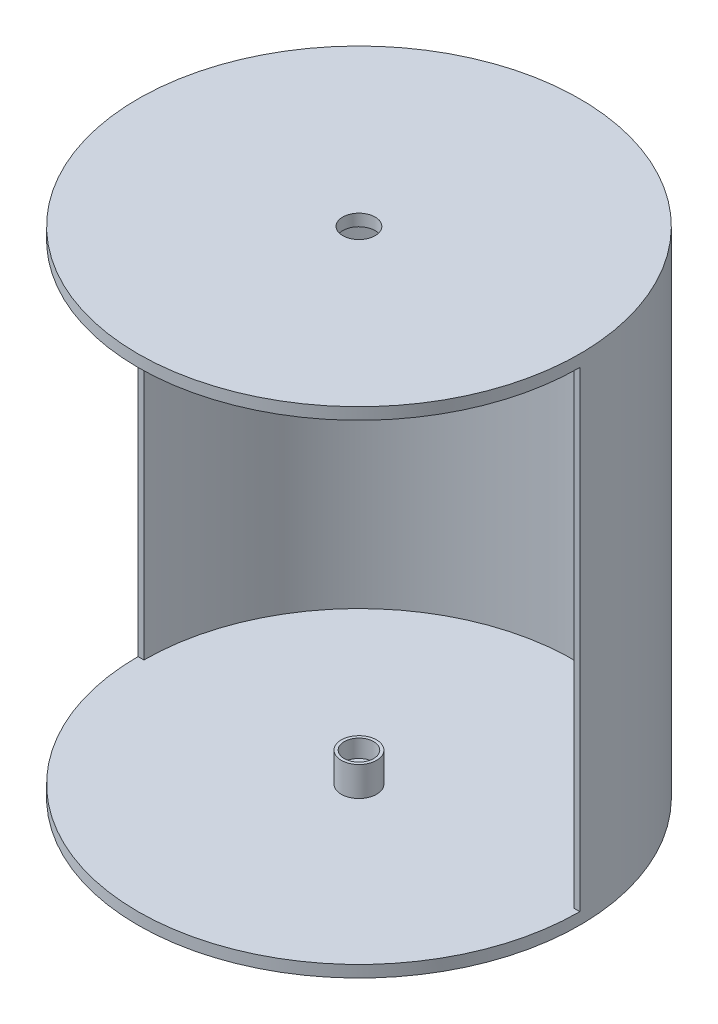
ISO-10303-21;
HEADER;
FILE_DESCRIPTION(('STEP AP214'),'2;1');
FILE_NAME('part.step','',(''),(''),'','','');
FILE_SCHEMA(('AUTOMOTIVE_DESIGN { 1 0 10303 214 1 1 1 1 }'));
ENDSEC;
DATA;
#1=APPLICATION_CONTEXT('core data for automotive mechanical design processes');
#2=APPLICATION_PROTOCOL_DEFINITION('international standard','automotive_design',2000,#1);
#3=PRODUCT_CONTEXT('',#1,'mechanical');
#4=PRODUCT('Part','Part','',(#3));
#5=PRODUCT_RELATED_PRODUCT_CATEGORY('part','',(#4));
#6=PRODUCT_DEFINITION_FORMATION('','',#4);
#7=PRODUCT_DEFINITION_CONTEXT('part definition',#1,'design');
#8=PRODUCT_DEFINITION('design','',#6,#7);
#9=PRODUCT_DEFINITION_SHAPE('','',#8);
#10=(LENGTH_UNIT() NAMED_UNIT(*) SI_UNIT(.MILLI.,.METRE.));
#11=(NAMED_UNIT(*) PLANE_ANGLE_UNIT() SI_UNIT($,.RADIAN.));
#12=(NAMED_UNIT(*) SI_UNIT($,.STERADIAN.) SOLID_ANGLE_UNIT());
#13=UNCERTAINTY_MEASURE_WITH_UNIT(LENGTH_MEASURE(1.E-05),#10,'distance_accuracy_value','');
#14=(GEOMETRIC_REPRESENTATION_CONTEXT(3) GLOBAL_UNCERTAINTY_ASSIGNED_CONTEXT((#13)) GLOBAL_UNIT_ASSIGNED_CONTEXT((#10,
#11,#12)) REPRESENTATION_CONTEXT('',''));
#15=CARTESIAN_POINT('',(0.,0.,0.));
#16=DIRECTION('',(0.,0.,1.));
#17=DIRECTION('',(1.,0.,0.));
#18=AXIS2_PLACEMENT_3D('',#15,#16,#17);
#19=CARTESIAN_POINT('',(0.,2.,0.));
#20=DIRECTION('',(0.,1.,0.));
#21=DIRECTION('',(0.,0.,1.));
#22=AXIS2_PLACEMENT_3D('',#19,#20,#21);
#23=PLANE('',#22);
#24=CARTESIAN_POINT('',(0.,2.,0.));
#25=DIRECTION('',(0.,1.,0.));
#26=DIRECTION('',(0.,0.,1.));
#27=AXIS2_PLACEMENT_3D('',#24,#25,#26);
#28=CIRCLE('',#27,3.);
#29=CARTESIAN_POINT('',(0.,2.,3.));
#30=VERTEX_POINT('',#29);
#31=EDGE_CURVE('E140',#30,#30,#28,.T.);
#32=ORIENTED_EDGE('',*,*,#31,.F.);
#33=EDGE_LOOP('',(#32));
#34=FACE_BOUND('',#33,.T.);
#35=CARTESIAN_POINT('',(0.,2.,0.));
#36=DIRECTION('',(0.,-1.,0.));
#37=DIRECTION('',(0.,0.,1.));
#38=AXIS2_PLACEMENT_3D('',#35,#36,#37);
#39=CIRCLE('',#38,36.5);
#40=CARTESIAN_POINT('',(-36.5,2.,0.));
#41=VERTEX_POINT('',#40);
#42=CARTESIAN_POINT('',(36.5,2.,0.));
#43=VERTEX_POINT('',#42);
#44=EDGE_CURVE('E122',#41,#43,#39,.T.);
#45=ORIENTED_EDGE('',*,*,#44,.F.);
#46=DIRECTION('',(1.,0.,0.));
#47=VECTOR('',#46,1.);
#48=CARTESIAN_POINT('',(-37.5,2.,0.));
#49=LINE('',#48,#47);
#50=CARTESIAN_POINT('',(-37.5,2.,0.));
#51=VERTEX_POINT('',#50);
#52=EDGE_CURVE('E109',#51,#41,#49,.T.);
#53=ORIENTED_EDGE('',*,*,#52,.F.);
#54=CARTESIAN_POINT('',(0.,2.,0.));
#55=DIRECTION('',(0.,1.,0.));
#56=DIRECTION('',(0.,0.,1.));
#57=AXIS2_PLACEMENT_3D('',#54,#55,#56);
#58=CIRCLE('',#57,37.5);
#59=CARTESIAN_POINT('',(37.5,2.,0.));
#60=VERTEX_POINT('',#59);
#61=EDGE_CURVE('E11',#51,#60,#58,.T.);
#62=ORIENTED_EDGE('',*,*,#61,.T.);
#63=DIRECTION('',(1.,0.,0.));
#64=VECTOR('',#63,1.);
#65=CARTESIAN_POINT('',(36.5,2.,0.));
#66=LINE('',#65,#64);
#67=EDGE_CURVE('E75',#43,#60,#66,.T.);
#68=ORIENTED_EDGE('',*,*,#67,.F.);
#69=EDGE_LOOP('',(#45,#53,#62,#68));
#70=FACE_BOUND('',#69,.T.);
#71=ADVANCED_FACE('F39',(#34,#70),#23,.T.);
#72=CARTESIAN_POINT('',(0.,2.,0.));
#73=DIRECTION('',(0.,-1.,0.));
#74=DIRECTION('',(0.,0.,-1.));
#75=AXIS2_PLACEMENT_3D('',#72,#73,#74);
#76=CYLINDRICAL_SURFACE('',#75,37.5);
#77=ORIENTED_EDGE('',*,*,#61,.F.);
#78=DIRECTION('',(0.,-1.,0.));
#79=VECTOR('',#78,1.);
#80=CARTESIAN_POINT('',(-37.5,82.,0.));
#81=LINE('',#80,#79);
#82=CARTESIAN_POINT('',(-37.5,82.,0.));
#83=VERTEX_POINT('',#82);
#84=EDGE_CURVE('E101',#83,#51,#81,.T.);
#85=ORIENTED_EDGE('',*,*,#84,.F.);
#86=CARTESIAN_POINT('',(0.,82.,0.));
#87=DIRECTION('',(0.,1.,0.));
#88=DIRECTION('',(0.,0.,1.));
#89=AXIS2_PLACEMENT_3D('',#86,#87,#88);
#90=CIRCLE('',#89,37.5);
#91=CARTESIAN_POINT('',(37.5,82.,0.));
#92=VERTEX_POINT('',#91);
#93=EDGE_CURVE('E96',#83,#92,#90,.T.);
#94=ORIENTED_EDGE('',*,*,#93,.T.);
#95=DIRECTION('',(0.,-1.,0.));
#96=VECTOR('',#95,1.);
#97=CARTESIAN_POINT('',(37.5,82.,0.));
#98=LINE('',#97,#96);
#99=EDGE_CURVE('E83',#92,#60,#98,.T.);
#100=ORIENTED_EDGE('',*,*,#99,.T.);
#101=EDGE_LOOP('',(#77,#85,#94,#100));
#102=FACE_BOUND('',#101,.T.);
#103=CARTESIAN_POINT('',(0.,0.,0.));
#104=DIRECTION('',(0.,1.,0.));
#105=DIRECTION('',(0.,0.,1.));
#106=AXIS2_PLACEMENT_3D('',#103,#104,#105);
#107=CIRCLE('',#106,37.5);
#108=CARTESIAN_POINT('',(0.,0.,37.5));
#109=VERTEX_POINT('',#108);
#110=EDGE_CURVE('E43',#109,#109,#107,.T.);
#111=ORIENTED_EDGE('',*,*,#110,.T.);
#112=EDGE_LOOP('',(#111));
#113=FACE_BOUND('',#112,.T.);
#114=CARTESIAN_POINT('',(0.,84.,0.));
#115=DIRECTION('',(0.,1.,0.));
#116=DIRECTION('',(0.,0.,1.));
#117=AXIS2_PLACEMENT_3D('',#114,#115,#116);
#118=CIRCLE('',#117,37.5);
#119=CARTESIAN_POINT('',(0.,84.,37.5));
#120=VERTEX_POINT('',#119);
#121=EDGE_CURVE('E103',#120,#120,#118,.T.);
#122=ORIENTED_EDGE('',*,*,#121,.F.);
#123=EDGE_LOOP('',(#122));
#124=FACE_BOUND('',#123,.T.);
#125=ADVANCED_FACE('F41',(#102,#113,#124),#76,.T.);
#126=CARTESIAN_POINT('',(0.,0.,0.));
#127=DIRECTION('',(0.,1.,0.));
#128=DIRECTION('',(0.,0.,1.));
#129=AXIS2_PLACEMENT_3D('',#126,#127,#128);
#130=PLANE('',#129);
#131=ORIENTED_EDGE('',*,*,#110,.F.);
#132=EDGE_LOOP('',(#131));
#133=FACE_BOUND('',#132,.T.);
#134=ADVANCED_FACE('F182',(#133),#130,.F.);
#135=CARTESIAN_POINT('',(0.,7.,0.));
#136=DIRECTION('',(0.,-1.,0.));
#137=DIRECTION('',(0.,0.,-1.));
#138=AXIS2_PLACEMENT_3D('',#135,#136,#137);
#139=CYLINDRICAL_SURFACE('',#138,3.);
#140=CARTESIAN_POINT('',(0.,7.,0.));
#141=DIRECTION('',(0.,1.,0.));
#142=DIRECTION('',(0.,0.,1.));
#143=AXIS2_PLACEMENT_3D('',#140,#141,#142);
#144=CIRCLE('',#143,3.);
#145=CARTESIAN_POINT('',(0.,7.,3.));
#146=VERTEX_POINT('',#145);
#147=EDGE_CURVE('E144',#146,#146,#144,.T.);
#148=ORIENTED_EDGE('',*,*,#147,.F.);
#149=EDGE_LOOP('',(#148));
#150=FACE_BOUND('',#149,.T.);
#151=ORIENTED_EDGE('',*,*,#31,.T.);
#152=EDGE_LOOP('',(#151));
#153=FACE_BOUND('',#152,.T.);
#154=ADVANCED_FACE('F152',(#150,#153),#139,.T.);
#155=CARTESIAN_POINT('',(0.,7.,0.));
#156=DIRECTION('',(0.,1.,0.));
#157=DIRECTION('',(0.,0.,1.));
#158=AXIS2_PLACEMENT_3D('',#155,#156,#157);
#159=PLANE('',#158);
#160=CARTESIAN_POINT('',(0.,7.,0.));
#161=DIRECTION('',(0.,1.,0.));
#162=DIRECTION('',(0.,0.,1.));
#163=AXIS2_PLACEMENT_3D('',#160,#161,#162);
#164=CIRCLE('',#163,2.5);
#165=CARTESIAN_POINT('',(0.,7.,2.5));
#166=VERTEX_POINT('',#165);
#167=EDGE_CURVE('E135',#166,#166,#164,.T.);
#168=ORIENTED_EDGE('',*,*,#167,.F.);
#169=EDGE_LOOP('',(#168));
#170=FACE_BOUND('',#169,.T.);
#171=ORIENTED_EDGE('',*,*,#147,.T.);
#172=EDGE_LOOP('',(#171));
#173=FACE_BOUND('',#172,.T.);
#174=ADVANCED_FACE('F176',(#170,#173),#159,.T.);
#175=CARTESIAN_POINT('',(0.,4.,0.));
#176=DIRECTION('',(0.,1.,0.));
#177=DIRECTION('',(0.,0.,1.));
#178=AXIS2_PLACEMENT_3D('',#175,#176,#177);
#179=CYLINDRICAL_SURFACE('',#178,2.5);
#180=CARTESIAN_POINT('',(0.,4.,0.));
#181=DIRECTION('',(0.,1.,0.));
#182=DIRECTION('',(0.,0.,1.));
#183=AXIS2_PLACEMENT_3D('',#180,#181,#182);
#184=CIRCLE('',#183,2.5);
#185=CARTESIAN_POINT('',(0.,4.,2.5));
#186=VERTEX_POINT('',#185);
#187=EDGE_CURVE('E136',#186,#186,#184,.T.);
#188=ORIENTED_EDGE('',*,*,#187,.F.);
#189=EDGE_LOOP('',(#188));
#190=FACE_BOUND('',#189,.T.);
#191=ORIENTED_EDGE('',*,*,#167,.T.);
#192=EDGE_LOOP('',(#191));
#193=FACE_BOUND('',#192,.T.);
#194=ADVANCED_FACE('F169',(#190,#193),#179,.F.);
#195=CARTESIAN_POINT('',(0.,4.,0.));
#196=DIRECTION('',(0.,1.,0.));
#197=DIRECTION('',(0.,0.,1.));
#198=AXIS2_PLACEMENT_3D('',#195,#196,#197);
#199=PLANE('',#198);
#200=ORIENTED_EDGE('',*,*,#187,.T.);
#201=EDGE_LOOP('',(#200));
#202=FACE_BOUND('',#201,.T.);
#203=ADVANCED_FACE('F162',(#202),#199,.T.);
#204=CARTESIAN_POINT('',(-37.5,82.,0.));
#205=DIRECTION('',(0.,0.,-1.));
#206=DIRECTION('',(-1.,0.,0.));
#207=AXIS2_PLACEMENT_3D('',#204,#205,#206);
#208=PLANE('',#207);
#209=ORIENTED_EDGE('',*,*,#52,.T.);
#210=DIRECTION('',(0.,-1.,0.));
#211=VECTOR('',#210,1.);
#212=CARTESIAN_POINT('',(-36.5,82.,0.));
#213=LINE('',#212,#211);
#214=CARTESIAN_POINT('',(-36.5,82.,0.));
#215=VERTEX_POINT('',#214);
#216=EDGE_CURVE('E129',#215,#41,#213,.T.);
#217=ORIENTED_EDGE('',*,*,#216,.F.);
#218=DIRECTION('',(1.,0.,0.));
#219=VECTOR('',#218,1.);
#220=CARTESIAN_POINT('',(-37.5,82.,0.));
#221=LINE('',#220,#219);
#222=EDGE_CURVE('E80',#83,#215,#221,.T.);
#223=ORIENTED_EDGE('',*,*,#222,.F.);
#224=ORIENTED_EDGE('',*,*,#84,.T.);
#225=EDGE_LOOP('',(#209,#217,#223,#224));
#226=FACE_BOUND('',#225,.T.);
#227=ADVANCED_FACE('F160',(#226),#208,.F.);
#228=CARTESIAN_POINT('',(0.,82.,0.));
#229=DIRECTION('',(0.,-1.,0.));
#230=DIRECTION('',(0.,0.,-1.));
#231=AXIS2_PLACEMENT_3D('',#228,#229,#230);
#232=CYLINDRICAL_SURFACE('',#231,36.5);
#233=ORIENTED_EDGE('',*,*,#44,.T.);
#234=DIRECTION('',(0.,-1.,0.));
#235=VECTOR('',#234,1.);
#236=CARTESIAN_POINT('',(36.5,82.,0.));
#237=LINE('',#236,#235);
#238=CARTESIAN_POINT('',(36.5,82.,0.));
#239=VERTEX_POINT('',#238);
#240=EDGE_CURVE('E55',#239,#43,#237,.T.);
#241=ORIENTED_EDGE('',*,*,#240,.F.);
#242=CARTESIAN_POINT('',(0.,82.,0.));
#243=DIRECTION('',(0.,-1.,0.));
#244=DIRECTION('',(0.,0.,1.));
#245=AXIS2_PLACEMENT_3D('',#242,#243,#244);
#246=CIRCLE('',#245,36.5);
#247=EDGE_CURVE('E97',#215,#239,#246,.T.);
#248=ORIENTED_EDGE('',*,*,#247,.F.);
#249=ORIENTED_EDGE('',*,*,#216,.T.);
#250=EDGE_LOOP('',(#233,#241,#248,#249));
#251=FACE_BOUND('',#250,.T.);
#252=ADVANCED_FACE('F159',(#251),#232,.F.);
#253=CARTESIAN_POINT('',(36.5,82.,0.));
#254=DIRECTION('',(0.,0.,-1.));
#255=DIRECTION('',(-1.,0.,0.));
#256=AXIS2_PLACEMENT_3D('',#253,#254,#255);
#257=PLANE('',#256);
#258=ORIENTED_EDGE('',*,*,#67,.T.);
#259=ORIENTED_EDGE('',*,*,#99,.F.);
#260=DIRECTION('',(1.,0.,0.));
#261=VECTOR('',#260,1.);
#262=CARTESIAN_POINT('',(36.5,82.,0.));
#263=LINE('',#262,#261);
#264=EDGE_CURVE('E86',#239,#92,#263,.T.);
#265=ORIENTED_EDGE('',*,*,#264,.F.);
#266=ORIENTED_EDGE('',*,*,#240,.T.);
#267=EDGE_LOOP('',(#258,#259,#265,#266));
#268=FACE_BOUND('',#267,.T.);
#269=ADVANCED_FACE('F85',(#268),#257,.F.);
#270=CARTESIAN_POINT('',(0.,82.,0.));
#271=DIRECTION('',(0.,1.,0.));
#272=DIRECTION('',(0.,0.,1.));
#273=AXIS2_PLACEMENT_3D('',#270,#271,#272);
#274=PLANE('',#273);
#275=CARTESIAN_POINT('',(0.,82.,0.));
#276=DIRECTION('',(0.,1.,0.));
#277=DIRECTION('',(0.,0.,1.));
#278=AXIS2_PLACEMENT_3D('',#275,#276,#277);
#279=CIRCLE('',#278,2.75);
#280=CARTESIAN_POINT('',(0.,82.,2.75));
#281=VERTEX_POINT('',#280);
#282=EDGE_CURVE('E112',#281,#281,#279,.T.);
#283=ORIENTED_EDGE('',*,*,#282,.T.);
#284=EDGE_LOOP('',(#283));
#285=FACE_BOUND('',#284,.T.);
#286=ORIENTED_EDGE('',*,*,#93,.F.);
#287=ORIENTED_EDGE('',*,*,#222,.T.);
#288=ORIENTED_EDGE('',*,*,#247,.T.);
#289=ORIENTED_EDGE('',*,*,#264,.T.);
#290=EDGE_LOOP('',(#286,#287,#288,#289));
#291=FACE_BOUND('',#290,.T.);
#292=ADVANCED_FACE('F95',(#285,#291),#274,.F.);
#293=CARTESIAN_POINT('',(0.,84.,0.));
#294=DIRECTION('',(0.,1.,0.));
#295=DIRECTION('',(0.,0.,1.));
#296=AXIS2_PLACEMENT_3D('',#293,#294,#295);
#297=PLANE('',#296);
#298=ORIENTED_EDGE('',*,*,#121,.T.);
#299=EDGE_LOOP('',(#298));
#300=FACE_BOUND('',#299,.T.);
#301=CARTESIAN_POINT('',(0.,84.,0.));
#302=DIRECTION('',(0.,1.,0.));
#303=DIRECTION('',(0.,0.,1.));
#304=AXIS2_PLACEMENT_3D('',#301,#302,#303);
#305=CIRCLE('',#304,2.75);
#306=CARTESIAN_POINT('',(0.,84.,2.75));
#307=VERTEX_POINT('',#306);
#308=EDGE_CURVE('E104',#307,#307,#305,.T.);
#309=ORIENTED_EDGE('',*,*,#308,.F.);
#310=EDGE_LOOP('',(#309));
#311=FACE_BOUND('',#310,.T.);
#312=ADVANCED_FACE('F195',(#300,#311),#297,.T.);
#313=CARTESIAN_POINT('',(0.,84.,0.));
#314=DIRECTION('',(0.,-1.,0.));
#315=DIRECTION('',(0.,0.,-1.));
#316=AXIS2_PLACEMENT_3D('',#313,#314,#315);
#317=CYLINDRICAL_SURFACE('',#316,2.75);
#318=ORIENTED_EDGE('',*,*,#308,.T.);
#319=EDGE_LOOP('',(#318));
#320=FACE_BOUND('',#319,.T.);
#321=ORIENTED_EDGE('',*,*,#282,.F.);
#322=EDGE_LOOP('',(#321));
#323=FACE_BOUND('',#322,.T.);
#324=ADVANCED_FACE('F198',(#320,#323),#317,.F.);
#325=CLOSED_SHELL('',(#71,#125,#134,#154,#174,#194,#203,#227,#252,#269,#292,#312,#324));
#326=MANIFOLD_SOLID_BREP('B2',#325);
#327=ADVANCED_BREP_SHAPE_REPRESENTATION('',(#18,#326),#14);
#328=SHAPE_DEFINITION_REPRESENTATION(#9,#327);
ENDSEC;
END-ISO-10303-21;
